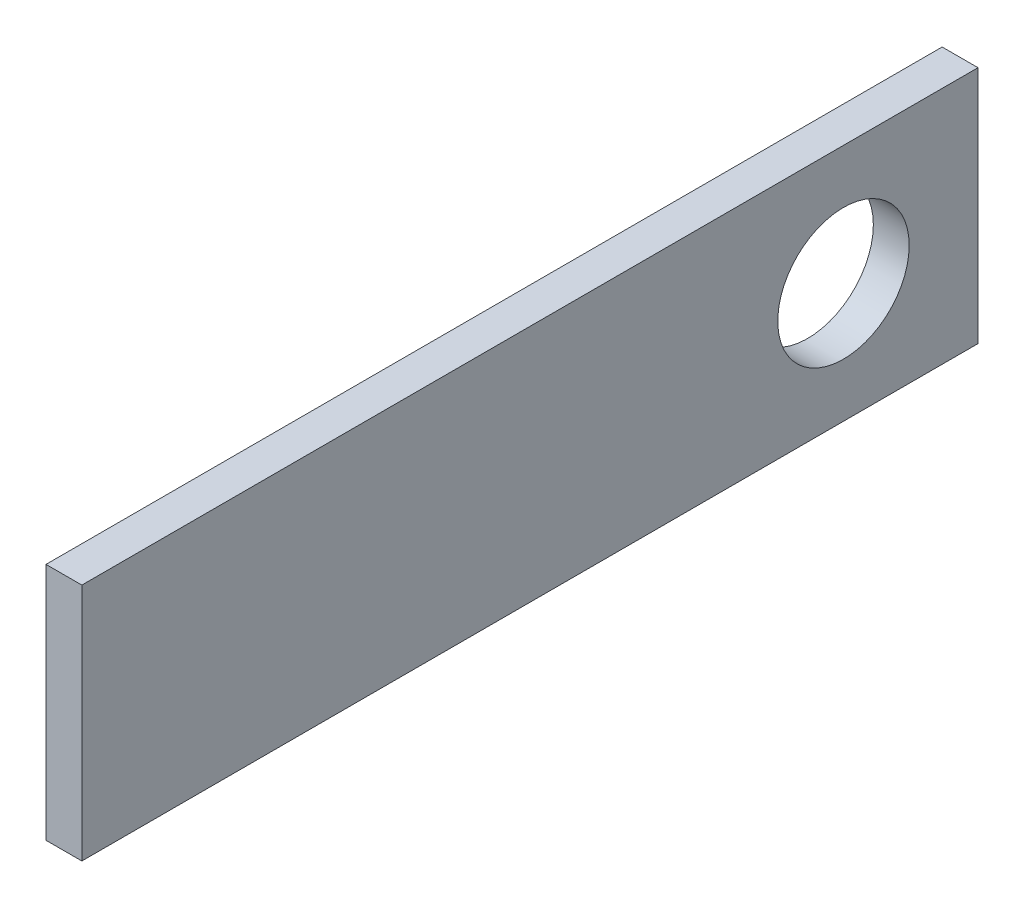
ISO-10303-21;
HEADER;
FILE_DESCRIPTION(('STEP AP214'),'2;1');
FILE_NAME('part.step','',(''),(''),'','','');
FILE_SCHEMA(('AUTOMOTIVE_DESIGN { 1 0 10303 214 1 1 1 1 }'));
ENDSEC;
DATA;
#1=APPLICATION_CONTEXT('core data for automotive mechanical design processes');
#2=APPLICATION_PROTOCOL_DEFINITION('international standard','automotive_design',2000,#1);
#3=PRODUCT_CONTEXT('',#1,'mechanical');
#4=PRODUCT('Part','Part','',(#3));
#5=PRODUCT_RELATED_PRODUCT_CATEGORY('part','',(#4));
#6=PRODUCT_DEFINITION_FORMATION('','',#4);
#7=PRODUCT_DEFINITION_CONTEXT('part definition',#1,'design');
#8=PRODUCT_DEFINITION('design','',#6,#7);
#9=PRODUCT_DEFINITION_SHAPE('','',#8);
#10=(LENGTH_UNIT() NAMED_UNIT(*) SI_UNIT(.MILLI.,.METRE.));
#11=(NAMED_UNIT(*) PLANE_ANGLE_UNIT() SI_UNIT($,.RADIAN.));
#12=(NAMED_UNIT(*) SI_UNIT($,.STERADIAN.) SOLID_ANGLE_UNIT());
#13=UNCERTAINTY_MEASURE_WITH_UNIT(LENGTH_MEASURE(1.E-05),#10,'distance_accuracy_value','');
#14=(GEOMETRIC_REPRESENTATION_CONTEXT(3) GLOBAL_UNCERTAINTY_ASSIGNED_CONTEXT((#13)) GLOBAL_UNIT_ASSIGNED_CONTEXT((#10,
#11,#12)) REPRESENTATION_CONTEXT('',''));
#15=CARTESIAN_POINT('',(0.,0.,0.));
#16=DIRECTION('',(0.,0.,1.));
#17=DIRECTION('',(1.,0.,0.));
#18=AXIS2_PLACEMENT_3D('',#15,#16,#17);
#19=CARTESIAN_POINT('',(3.,0.,0.));
#20=DIRECTION('',(1.,0.,0.));
#21=DIRECTION('',(0.,0.,-1.));
#22=AXIS2_PLACEMENT_3D('',#19,#20,#21);
#23=PLANE('',#22);
#24=DIRECTION('',(0.,1.,0.));
#25=VECTOR('',#24,1.);
#26=CARTESIAN_POINT('',(3.,20.,-75.));
#27=LINE('',#26,#25);
#28=CARTESIAN_POINT('',(3.,-20.,-75.));
#29=VERTEX_POINT('',#28);
#30=CARTESIAN_POINT('',(3.,20.,-75.));
#31=VERTEX_POINT('',#30);
#32=EDGE_CURVE('E92',#29,#31,#27,.T.);
#33=ORIENTED_EDGE('',*,*,#32,.T.);
#34=DIRECTION('',(0.,0.,1.));
#35=VECTOR('',#34,1.);
#36=CARTESIAN_POINT('',(3.,20.,75.));
#37=LINE('',#36,#35);
#38=CARTESIAN_POINT('',(3.,20.,75.));
#39=VERTEX_POINT('',#38);
#40=EDGE_CURVE('E87',#31,#39,#37,.T.);
#41=ORIENTED_EDGE('',*,*,#40,.T.);
#42=DIRECTION('',(0.,-1.,0.));
#43=VECTOR('',#42,1.);
#44=CARTESIAN_POINT('',(3.,20.,75.));
#45=LINE('',#44,#43);
#46=CARTESIAN_POINT('',(3.,-20.,75.));
#47=VERTEX_POINT('',#46);
#48=EDGE_CURVE('E90',#39,#47,#45,.T.);
#49=ORIENTED_EDGE('',*,*,#48,.T.);
#50=DIRECTION('',(0.,0.,-1.));
#51=VECTOR('',#50,1.);
#52=CARTESIAN_POINT('',(3.,-20.,75.));
#53=LINE('',#52,#51);
#54=EDGE_CURVE('E57',#47,#29,#53,.T.);
#55=ORIENTED_EDGE('',*,*,#54,.T.);
#56=EDGE_LOOP('',(#33,#41,#49,#55));
#57=FACE_BOUND('',#56,.T.);
#58=CARTESIAN_POINT('',(3.,0.,-52.4812640331989));
#59=DIRECTION('',(1.,0.,0.));
#60=DIRECTION('',(0.,0.,-1.));
#61=AXIS2_PLACEMENT_3D('',#58,#59,#60);
#62=CIRCLE('',#61,11.);
#63=CARTESIAN_POINT('',(3.,0.,-63.4812640331989));
#64=VERTEX_POINT('',#63);
#65=EDGE_CURVE('E112',#64,#64,#62,.T.);
#66=ORIENTED_EDGE('',*,*,#65,.F.);
#67=EDGE_LOOP('',(#66));
#68=FACE_BOUND('',#67,.T.);
#69=ADVANCED_FACE('F39',(#57,#68),#23,.T.);
#70=CARTESIAN_POINT('',(-3.,0.,0.));
#71=DIRECTION('',(1.,0.,0.));
#72=DIRECTION('',(0.,0.,-1.));
#73=AXIS2_PLACEMENT_3D('',#70,#71,#72);
#74=PLANE('',#73);
#75=DIRECTION('',(0.,1.,0.));
#76=VECTOR('',#75,1.);
#77=CARTESIAN_POINT('',(-3.,20.,-75.));
#78=LINE('',#77,#76);
#79=CARTESIAN_POINT('',(-3.,-20.,-75.));
#80=VERTEX_POINT('',#79);
#81=CARTESIAN_POINT('',(-3.,20.,-75.));
#82=VERTEX_POINT('',#81);
#83=EDGE_CURVE('E108',#80,#82,#78,.T.);
#84=ORIENTED_EDGE('',*,*,#83,.F.);
#85=DIRECTION('',(0.,0.,-1.));
#86=VECTOR('',#85,1.);
#87=CARTESIAN_POINT('',(-3.,-20.,75.));
#88=LINE('',#87,#86);
#89=CARTESIAN_POINT('',(-3.,-20.,75.));
#90=VERTEX_POINT('',#89);
#91=EDGE_CURVE('E80',#90,#80,#88,.T.);
#92=ORIENTED_EDGE('',*,*,#91,.F.);
#93=DIRECTION('',(0.,-1.,0.));
#94=VECTOR('',#93,1.);
#95=CARTESIAN_POINT('',(-3.,20.,75.));
#96=LINE('',#95,#94);
#97=CARTESIAN_POINT('',(-3.,20.,75.));
#98=VERTEX_POINT('',#97);
#99=EDGE_CURVE('E74',#98,#90,#96,.T.);
#100=ORIENTED_EDGE('',*,*,#99,.F.);
#101=DIRECTION('',(0.,0.,1.));
#102=VECTOR('',#101,1.);
#103=CARTESIAN_POINT('',(-3.,20.,75.));
#104=LINE('',#103,#102);
#105=EDGE_CURVE('E97',#82,#98,#104,.T.);
#106=ORIENTED_EDGE('',*,*,#105,.F.);
#107=EDGE_LOOP('',(#84,#92,#100,#106));
#108=FACE_BOUND('',#107,.T.);
#109=CARTESIAN_POINT('',(-3.,0.,-52.4812640331989));
#110=DIRECTION('',(1.,0.,0.));
#111=DIRECTION('',(0.,0.,-1.));
#112=AXIS2_PLACEMENT_3D('',#109,#110,#111);
#113=CIRCLE('',#112,11.);
#114=CARTESIAN_POINT('',(-3.,0.,-63.4812640331989));
#115=VERTEX_POINT('',#114);
#116=EDGE_CURVE('E130',#115,#115,#113,.T.);
#117=ORIENTED_EDGE('',*,*,#116,.T.);
#118=EDGE_LOOP('',(#117));
#119=FACE_BOUND('',#118,.T.);
#120=ADVANCED_FACE('F125',(#108,#119),#74,.F.);
#121=CARTESIAN_POINT('',(3.,20.,-75.));
#122=DIRECTION('',(0.,0.,1.));
#123=DIRECTION('',(1.,0.,0.));
#124=AXIS2_PLACEMENT_3D('',#121,#122,#123);
#125=PLANE('',#124);
#126=ORIENTED_EDGE('',*,*,#83,.T.);
#127=DIRECTION('',(-1.,0.,0.));
#128=VECTOR('',#127,1.);
#129=CARTESIAN_POINT('',(3.,20.,-75.));
#130=LINE('',#129,#128);
#131=EDGE_CURVE('E11',#31,#82,#130,.T.);
#132=ORIENTED_EDGE('',*,*,#131,.F.);
#133=ORIENTED_EDGE('',*,*,#32,.F.);
#134=DIRECTION('',(-1.,0.,0.));
#135=VECTOR('',#134,1.);
#136=CARTESIAN_POINT('',(3.,-20.,-75.));
#137=LINE('',#136,#135);
#138=EDGE_CURVE('E104',#29,#80,#137,.T.);
#139=ORIENTED_EDGE('',*,*,#138,.T.);
#140=EDGE_LOOP('',(#126,#132,#133,#139));
#141=FACE_BOUND('',#140,.T.);
#142=ADVANCED_FACE('F41',(#141),#125,.F.);
#143=CARTESIAN_POINT('',(3.,20.,75.));
#144=DIRECTION('',(0.,-1.,0.));
#145=DIRECTION('',(0.,0.,-1.));
#146=AXIS2_PLACEMENT_3D('',#143,#144,#145);
#147=PLANE('',#146);
#148=ORIENTED_EDGE('',*,*,#105,.T.);
#149=DIRECTION('',(-1.,0.,0.));
#150=VECTOR('',#149,1.);
#151=CARTESIAN_POINT('',(3.,20.,75.));
#152=LINE('',#151,#150);
#153=EDGE_CURVE('E49',#39,#98,#152,.T.);
#154=ORIENTED_EDGE('',*,*,#153,.F.);
#155=ORIENTED_EDGE('',*,*,#40,.F.);
#156=ORIENTED_EDGE('',*,*,#131,.T.);
#157=EDGE_LOOP('',(#148,#154,#155,#156));
#158=FACE_BOUND('',#157,.T.);
#159=ADVANCED_FACE('F96',(#158),#147,.F.);
#160=CARTESIAN_POINT('',(3.,20.,75.));
#161=DIRECTION('',(0.,0.,-1.));
#162=DIRECTION('',(-1.,0.,0.));
#163=AXIS2_PLACEMENT_3D('',#160,#161,#162);
#164=PLANE('',#163);
#165=ORIENTED_EDGE('',*,*,#99,.T.);
#166=DIRECTION('',(-1.,0.,0.));
#167=VECTOR('',#166,1.);
#168=CARTESIAN_POINT('',(3.,-20.,75.));
#169=LINE('',#168,#167);
#170=EDGE_CURVE('E99',#47,#90,#169,.T.);
#171=ORIENTED_EDGE('',*,*,#170,.F.);
#172=ORIENTED_EDGE('',*,*,#48,.F.);
#173=ORIENTED_EDGE('',*,*,#153,.T.);
#174=EDGE_LOOP('',(#165,#171,#172,#173));
#175=FACE_BOUND('',#174,.T.);
#176=ADVANCED_FACE('F100',(#175),#164,.F.);
#177=CARTESIAN_POINT('',(3.,-20.,75.));
#178=DIRECTION('',(0.,1.,0.));
#179=DIRECTION('',(0.,0.,1.));
#180=AXIS2_PLACEMENT_3D('',#177,#178,#179);
#181=PLANE('',#180);
#182=ORIENTED_EDGE('',*,*,#91,.T.);
#183=ORIENTED_EDGE('',*,*,#138,.F.);
#184=ORIENTED_EDGE('',*,*,#54,.F.);
#185=ORIENTED_EDGE('',*,*,#170,.T.);
#186=EDGE_LOOP('',(#182,#183,#184,#185));
#187=FACE_BOUND('',#186,.T.);
#188=ADVANCED_FACE('F122',(#187),#181,.F.);
#189=CARTESIAN_POINT('',(3.,0.,-52.4812640331989));
#190=DIRECTION('',(-1.,0.,0.));
#191=DIRECTION('',(0.,0.,1.));
#192=AXIS2_PLACEMENT_3D('',#189,#190,#191);
#193=CYLINDRICAL_SURFACE('',#192,11.);
#194=ORIENTED_EDGE('',*,*,#65,.T.);
#195=EDGE_LOOP('',(#194));
#196=FACE_BOUND('',#195,.T.);
#197=ORIENTED_EDGE('',*,*,#116,.F.);
#198=EDGE_LOOP('',(#197));
#199=FACE_BOUND('',#198,.T.);
#200=ADVANCED_FACE('F138',(#196,#199),#193,.F.);
#201=CLOSED_SHELL('',(#69,#120,#142,#159,#176,#188,#200));
#202=MANIFOLD_SOLID_BREP('B2',#201);
#203=ADVANCED_BREP_SHAPE_REPRESENTATION('',(#18,#202),#14);
#204=SHAPE_DEFINITION_REPRESENTATION(#9,#203);
ENDSEC;
END-ISO-10303-21;
